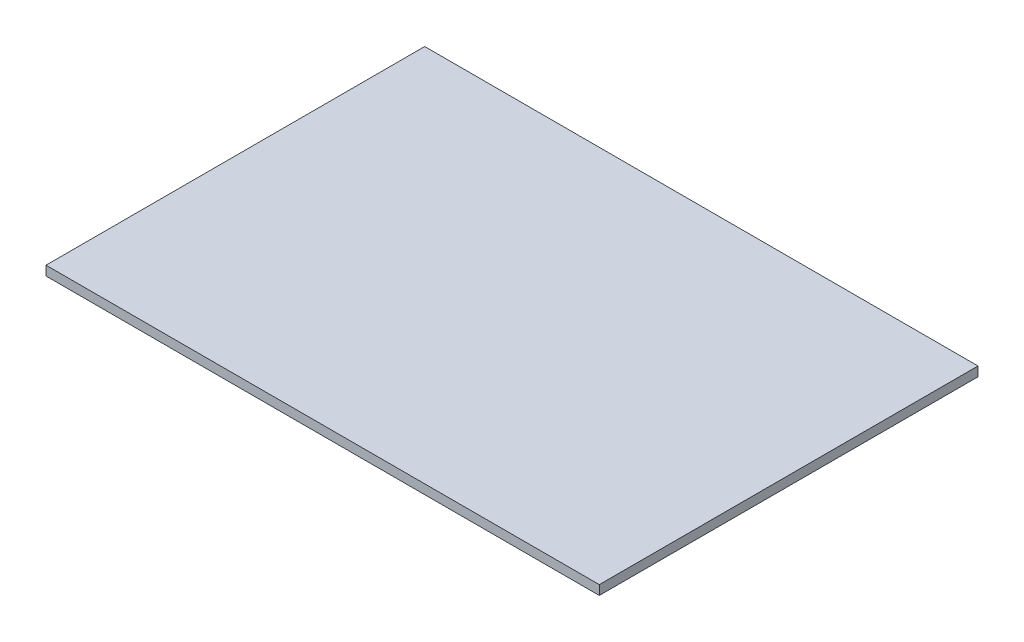
ISO-10303-21;
HEADER;
FILE_DESCRIPTION(('STEP AP214'),'2;1');
FILE_NAME('part.step','',(''),(''),'','','');
FILE_SCHEMA(('AUTOMOTIVE_DESIGN { 1 0 10303 214 1 1 1 1 }'));
ENDSEC;
DATA;
#1=APPLICATION_CONTEXT('core data for automotive mechanical design processes');
#2=APPLICATION_PROTOCOL_DEFINITION('international standard','automotive_design',2000,#1);
#3=PRODUCT_CONTEXT('',#1,'mechanical');
#4=PRODUCT('Part','Part','',(#3));
#5=PRODUCT_RELATED_PRODUCT_CATEGORY('part','',(#4));
#6=PRODUCT_DEFINITION_FORMATION('','',#4);
#7=PRODUCT_DEFINITION_CONTEXT('part definition',#1,'design');
#8=PRODUCT_DEFINITION('design','',#6,#7);
#9=PRODUCT_DEFINITION_SHAPE('','',#8);
#10=(LENGTH_UNIT() NAMED_UNIT(*) SI_UNIT(.MILLI.,.METRE.));
#11=(NAMED_UNIT(*) PLANE_ANGLE_UNIT() SI_UNIT($,.RADIAN.));
#12=(NAMED_UNIT(*) SI_UNIT($,.STERADIAN.) SOLID_ANGLE_UNIT());
#13=UNCERTAINTY_MEASURE_WITH_UNIT(LENGTH_MEASURE(1.E-05),#10,'distance_accuracy_value','');
#14=(GEOMETRIC_REPRESENTATION_CONTEXT(3) GLOBAL_UNCERTAINTY_ASSIGNED_CONTEXT((#13)) GLOBAL_UNIT_ASSIGNED_CONTEXT((#10,
#11,#12)) REPRESENTATION_CONTEXT('',''));
#15=CARTESIAN_POINT('',(0.,0.,0.));
#16=DIRECTION('',(0.,0.,1.));
#17=DIRECTION('',(1.,0.,0.));
#18=AXIS2_PLACEMENT_3D('',#15,#16,#17);
#19=CARTESIAN_POINT('',(0.,3.5,0.));
#20=DIRECTION('',(0.,0.,-1.));
#21=DIRECTION('',(-1.,0.,0.));
#22=AXIS2_PLACEMENT_3D('',#19,#20,#21);
#23=PLANE('',#22);
#24=DIRECTION('',(1.,0.,0.));
#25=VECTOR('',#24,1.);
#26=CARTESIAN_POINT('',(0.,0.,0.));
#27=LINE('',#26,#25);
#28=CARTESIAN_POINT('',(0.,0.,0.));
#29=VERTEX_POINT('',#28);
#30=CARTESIAN_POINT('',(206.,0.,0.));
#31=VERTEX_POINT('',#30);
#32=EDGE_CURVE('E98',#29,#31,#27,.T.);
#33=ORIENTED_EDGE('',*,*,#32,.T.);
#34=DIRECTION('',(0.,-1.,0.));
#35=VECTOR('',#34,1.);
#36=CARTESIAN_POINT('',(206.,3.5,0.));
#37=LINE('',#36,#35);
#38=CARTESIAN_POINT('',(206.,3.5,0.));
#39=VERTEX_POINT('',#38);
#40=EDGE_CURVE('E11',#39,#31,#37,.T.);
#41=ORIENTED_EDGE('',*,*,#40,.F.);
#42=DIRECTION('',(1.,0.,0.));
#43=VECTOR('',#42,1.);
#44=CARTESIAN_POINT('',(0.,3.5,0.));
#45=LINE('',#44,#43);
#46=CARTESIAN_POINT('',(0.,3.5,0.));
#47=VERTEX_POINT('',#46);
#48=EDGE_CURVE('E84',#47,#39,#45,.T.);
#49=ORIENTED_EDGE('',*,*,#48,.F.);
#50=DIRECTION('',(0.,-1.,0.));
#51=VECTOR('',#50,1.);
#52=CARTESIAN_POINT('',(0.,3.5,0.));
#53=LINE('',#52,#51);
#54=EDGE_CURVE('E51',#47,#29,#53,.T.);
#55=ORIENTED_EDGE('',*,*,#54,.T.);
#56=EDGE_LOOP('',(#33,#41,#49,#55));
#57=FACE_BOUND('',#56,.T.);
#58=ADVANCED_FACE('F35',(#57),#23,.F.);
#59=CARTESIAN_POINT('',(206.,3.5,0.));
#60=DIRECTION('',(-1.,0.,0.));
#61=DIRECTION('',(0.,0.,1.));
#62=AXIS2_PLACEMENT_3D('',#59,#60,#61);
#63=PLANE('',#62);
#64=DIRECTION('',(0.,0.,-1.));
#65=VECTOR('',#64,1.);
#66=CARTESIAN_POINT('',(206.,0.,0.));
#67=LINE('',#66,#65);
#68=CARTESIAN_POINT('',(206.,0.,-141.));
#69=VERTEX_POINT('',#68);
#70=EDGE_CURVE('E89',#31,#69,#67,.T.);
#71=ORIENTED_EDGE('',*,*,#70,.T.);
#72=DIRECTION('',(0.,-1.,0.));
#73=VECTOR('',#72,1.);
#74=CARTESIAN_POINT('',(206.,3.5,-141.));
#75=LINE('',#74,#73);
#76=CARTESIAN_POINT('',(206.,3.5,-141.));
#77=VERTEX_POINT('',#76);
#78=EDGE_CURVE('E43',#77,#69,#75,.T.);
#79=ORIENTED_EDGE('',*,*,#78,.F.);
#80=DIRECTION('',(0.,0.,-1.));
#81=VECTOR('',#80,1.);
#82=CARTESIAN_POINT('',(206.,3.5,0.));
#83=LINE('',#82,#81);
#84=EDGE_CURVE('E76',#39,#77,#83,.T.);
#85=ORIENTED_EDGE('',*,*,#84,.F.);
#86=ORIENTED_EDGE('',*,*,#40,.T.);
#87=EDGE_LOOP('',(#71,#79,#85,#86));
#88=FACE_BOUND('',#87,.T.);
#89=ADVANCED_FACE('F88',(#88),#63,.F.);
#90=CARTESIAN_POINT('',(0.,3.5,-141.));
#91=DIRECTION('',(0.,0.,-1.));
#92=DIRECTION('',(-1.,0.,0.));
#93=AXIS2_PLACEMENT_3D('',#90,#91,#92);
#94=PLANE('',#93);
#95=DIRECTION('',(1.,0.,0.));
#96=VECTOR('',#95,1.);
#97=CARTESIAN_POINT('',(0.,0.,-141.));
#98=LINE('',#97,#96);
#99=CARTESIAN_POINT('',(0.,0.,-141.));
#100=VERTEX_POINT('',#99);
#101=EDGE_CURVE('E102',#100,#69,#98,.T.);
#102=ORIENTED_EDGE('',*,*,#101,.F.);
#103=DIRECTION('',(0.,-1.,0.));
#104=VECTOR('',#103,1.);
#105=CARTESIAN_POINT('',(0.,3.5,-141.));
#106=LINE('',#105,#104);
#107=CARTESIAN_POINT('',(0.,3.5,-141.));
#108=VERTEX_POINT('',#107);
#109=EDGE_CURVE('E65',#108,#100,#106,.T.);
#110=ORIENTED_EDGE('',*,*,#109,.F.);
#111=DIRECTION('',(1.,0.,0.));
#112=VECTOR('',#111,1.);
#113=CARTESIAN_POINT('',(0.,3.5,-141.));
#114=LINE('',#113,#112);
#115=EDGE_CURVE('E83',#108,#77,#114,.T.);
#116=ORIENTED_EDGE('',*,*,#115,.T.);
#117=ORIENTED_EDGE('',*,*,#78,.T.);
#118=EDGE_LOOP('',(#102,#110,#116,#117));
#119=FACE_BOUND('',#118,.T.);
#120=ADVANCED_FACE('F92',(#119),#94,.T.);
#121=CARTESIAN_POINT('',(0.,3.5,0.));
#122=DIRECTION('',(-1.,0.,0.));
#123=DIRECTION('',(0.,0.,1.));
#124=AXIS2_PLACEMENT_3D('',#121,#122,#123);
#125=PLANE('',#124);
#126=DIRECTION('',(0.,0.,-1.));
#127=VECTOR('',#126,1.);
#128=CARTESIAN_POINT('',(0.,0.,0.));
#129=LINE('',#128,#127);
#130=EDGE_CURVE('E104',#29,#100,#129,.T.);
#131=ORIENTED_EDGE('',*,*,#130,.F.);
#132=ORIENTED_EDGE('',*,*,#54,.F.);
#133=DIRECTION('',(0.,0.,-1.));
#134=VECTOR('',#133,1.);
#135=CARTESIAN_POINT('',(0.,3.5,0.));
#136=LINE('',#135,#134);
#137=EDGE_CURVE('E93',#47,#108,#136,.T.);
#138=ORIENTED_EDGE('',*,*,#137,.T.);
#139=ORIENTED_EDGE('',*,*,#109,.T.);
#140=EDGE_LOOP('',(#131,#132,#138,#139));
#141=FACE_BOUND('',#140,.T.);
#142=ADVANCED_FACE('F150',(#141),#125,.T.);
#143=CARTESIAN_POINT('',(0.,3.5,0.));
#144=DIRECTION('',(0.,1.,0.));
#145=DIRECTION('',(0.,0.,1.));
#146=AXIS2_PLACEMENT_3D('',#143,#144,#145);
#147=PLANE('',#146);
#148=ORIENTED_EDGE('',*,*,#48,.T.);
#149=ORIENTED_EDGE('',*,*,#84,.T.);
#150=ORIENTED_EDGE('',*,*,#115,.F.);
#151=ORIENTED_EDGE('',*,*,#137,.F.);
#152=EDGE_LOOP('',(#148,#149,#150,#151));
#153=FACE_BOUND('',#152,.T.);
#154=ADVANCED_FACE('F80',(#153),#147,.T.);
#155=CARTESIAN_POINT('',(0.,0.,0.));
#156=DIRECTION('',(0.,1.,0.));
#157=DIRECTION('',(0.,0.,1.));
#158=AXIS2_PLACEMENT_3D('',#155,#156,#157);
#159=PLANE('',#158);
#160=CARTESIAN_POINT('',(4.49999999999998,0.,-136.5));
#161=DIRECTION('',(0.,1.,0.));
#162=DIRECTION('',(0.,0.,1.));
#163=AXIS2_PLACEMENT_3D('',#160,#161,#162);
#164=CIRCLE('',#163,1.972314148255);
#165=CARTESIAN_POINT('',(4.49999999999998,0.,-134.527685851745));
#166=VERTEX_POINT('',#165);
#167=EDGE_CURVE('E128',#166,#166,#164,.T.);
#168=ORIENTED_EDGE('',*,*,#167,.T.);
#169=EDGE_LOOP('',(#168));
#170=FACE_BOUND('',#169,.T.);
#171=CARTESIAN_POINT('',(4.5,0.,-4.5));
#172=DIRECTION('',(0.,1.,0.));
#173=DIRECTION('',(0.,0.,1.));
#174=AXIS2_PLACEMENT_3D('',#171,#172,#173);
#175=CIRCLE('',#174,1.972314148255);
#176=CARTESIAN_POINT('',(4.5,0.,-2.527685851745));
#177=VERTEX_POINT('',#176);
#178=EDGE_CURVE('E122',#177,#177,#175,.T.);
#179=ORIENTED_EDGE('',*,*,#178,.T.);
#180=EDGE_LOOP('',(#179));
#181=FACE_BOUND('',#180,.T.);
#182=CARTESIAN_POINT('',(201.5,0.,-4.5));
#183=DIRECTION('',(0.,1.,0.));
#184=DIRECTION('',(0.,0.,1.));
#185=AXIS2_PLACEMENT_3D('',#182,#183,#184);
#186=CIRCLE('',#185,1.972314148255);
#187=CARTESIAN_POINT('',(201.5,0.,-2.527685851745));
#188=VERTEX_POINT('',#187);
#189=EDGE_CURVE('E116',#188,#188,#186,.T.);
#190=ORIENTED_EDGE('',*,*,#189,.T.);
#191=EDGE_LOOP('',(#190));
#192=FACE_BOUND('',#191,.T.);
#193=CARTESIAN_POINT('',(201.5,0.,-104.5));
#194=DIRECTION('',(0.,1.,0.));
#195=DIRECTION('',(0.,0.,1.));
#196=AXIS2_PLACEMENT_3D('',#193,#194,#195);
#197=CIRCLE('',#196,1.972314148255);
#198=CARTESIAN_POINT('',(201.5,0.,-102.527685851745));
#199=VERTEX_POINT('',#198);
#200=EDGE_CURVE('E110',#199,#199,#197,.T.);
#201=ORIENTED_EDGE('',*,*,#200,.T.);
#202=EDGE_LOOP('',(#201));
#203=FACE_BOUND('',#202,.T.);
#204=ORIENTED_EDGE('',*,*,#32,.F.);
#205=ORIENTED_EDGE('',*,*,#130,.T.);
#206=ORIENTED_EDGE('',*,*,#101,.T.);
#207=ORIENTED_EDGE('',*,*,#70,.F.);
#208=EDGE_LOOP('',(#204,#205,#206,#207));
#209=FACE_BOUND('',#208,.T.);
#210=ADVANCED_FACE('F149',(#170,#181,#192,#203,#209),#159,.F.);
#211=CARTESIAN_POINT('',(201.5,1.85,-104.5));
#212=DIRECTION('',(0.,-1.,0.));
#213=DIRECTION('',(0.,0.,-1.));
#214=AXIS2_PLACEMENT_3D('',#211,#212,#213);
#215=CYLINDRICAL_SURFACE('',#214,1.972314148255);
#216=CARTESIAN_POINT('',(201.5,1.85,-104.5));
#217=DIRECTION('',(0.,1.,0.));
#218=DIRECTION('',(0.,0.,1.));
#219=AXIS2_PLACEMENT_3D('',#216,#217,#218);
#220=CIRCLE('',#219,1.972314148255);
#221=CARTESIAN_POINT('',(201.5,1.85,-102.527685851745));
#222=VERTEX_POINT('',#221);
#223=EDGE_CURVE('E113',#222,#222,#220,.T.);
#224=ORIENTED_EDGE('',*,*,#223,.T.);
#225=EDGE_LOOP('',(#224));
#226=FACE_BOUND('',#225,.T.);
#227=ORIENTED_EDGE('',*,*,#200,.F.);
#228=EDGE_LOOP('',(#227));
#229=FACE_BOUND('',#228,.T.);
#230=ADVANCED_FACE('F161',(#226,#229),#215,.F.);
#231=CARTESIAN_POINT('',(0.,1.85,0.));
#232=DIRECTION('',(0.,1.,0.));
#233=DIRECTION('',(0.,0.,1.));
#234=AXIS2_PLACEMENT_3D('',#231,#232,#233);
#235=PLANE('',#234);
#236=ORIENTED_EDGE('',*,*,#223,.F.);
#237=EDGE_LOOP('',(#236));
#238=FACE_BOUND('',#237,.T.);
#239=ADVANCED_FACE('F166',(#238),#235,.F.);
#240=CARTESIAN_POINT('',(201.5,1.85,-4.5));
#241=DIRECTION('',(0.,-1.,0.));
#242=DIRECTION('',(0.,0.,-1.));
#243=AXIS2_PLACEMENT_3D('',#240,#241,#242);
#244=CYLINDRICAL_SURFACE('',#243,1.972314148255);
#245=CARTESIAN_POINT('',(201.5,1.85,-4.5));
#246=DIRECTION('',(0.,1.,0.));
#247=DIRECTION('',(0.,0.,1.));
#248=AXIS2_PLACEMENT_3D('',#245,#246,#247);
#249=CIRCLE('',#248,1.972314148255);
#250=CARTESIAN_POINT('',(201.5,1.85,-2.527685851745));
#251=VERTEX_POINT('',#250);
#252=EDGE_CURVE('E119',#251,#251,#249,.T.);
#253=ORIENTED_EDGE('',*,*,#252,.T.);
#254=EDGE_LOOP('',(#253));
#255=FACE_BOUND('',#254,.T.);
#256=ORIENTED_EDGE('',*,*,#189,.F.);
#257=EDGE_LOOP('',(#256));
#258=FACE_BOUND('',#257,.T.);
#259=ADVANCED_FACE('F170',(#255,#258),#244,.F.);
#260=CARTESIAN_POINT('',(0.,1.85,0.));
#261=DIRECTION('',(0.,1.,0.));
#262=DIRECTION('',(0.,0.,1.));
#263=AXIS2_PLACEMENT_3D('',#260,#261,#262);
#264=PLANE('',#263);
#265=ORIENTED_EDGE('',*,*,#252,.F.);
#266=EDGE_LOOP('',(#265));
#267=FACE_BOUND('',#266,.T.);
#268=ADVANCED_FACE('F174',(#267),#264,.F.);
#269=CARTESIAN_POINT('',(4.5,1.85,-4.5));
#270=DIRECTION('',(0.,-1.,0.));
#271=DIRECTION('',(0.,0.,-1.));
#272=AXIS2_PLACEMENT_3D('',#269,#270,#271);
#273=CYLINDRICAL_SURFACE('',#272,1.972314148255);
#274=CARTESIAN_POINT('',(4.5,1.85,-4.5));
#275=DIRECTION('',(0.,1.,0.));
#276=DIRECTION('',(0.,0.,1.));
#277=AXIS2_PLACEMENT_3D('',#274,#275,#276);
#278=CIRCLE('',#277,1.972314148255);
#279=CARTESIAN_POINT('',(4.5,1.85,-2.527685851745));
#280=VERTEX_POINT('',#279);
#281=EDGE_CURVE('E125',#280,#280,#278,.T.);
#282=ORIENTED_EDGE('',*,*,#281,.T.);
#283=EDGE_LOOP('',(#282));
#284=FACE_BOUND('',#283,.T.);
#285=ORIENTED_EDGE('',*,*,#178,.F.);
#286=EDGE_LOOP('',(#285));
#287=FACE_BOUND('',#286,.T.);
#288=ADVANCED_FACE('F178',(#284,#287),#273,.F.);
#289=CARTESIAN_POINT('',(0.,1.85,0.));
#290=DIRECTION('',(0.,1.,0.));
#291=DIRECTION('',(0.,0.,1.));
#292=AXIS2_PLACEMENT_3D('',#289,#290,#291);
#293=PLANE('',#292);
#294=ORIENTED_EDGE('',*,*,#281,.F.);
#295=EDGE_LOOP('',(#294));
#296=FACE_BOUND('',#295,.T.);
#297=ADVANCED_FACE('F143',(#296),#293,.F.);
#298=CARTESIAN_POINT('',(4.49999999999998,1.85,-136.5));
#299=DIRECTION('',(0.,-1.,0.));
#300=DIRECTION('',(0.,0.,-1.));
#301=AXIS2_PLACEMENT_3D('',#298,#299,#300);
#302=CYLINDRICAL_SURFACE('',#301,1.972314148255);
#303=CARTESIAN_POINT('',(4.49999999999998,1.85,-136.5));
#304=DIRECTION('',(0.,1.,0.));
#305=DIRECTION('',(0.,0.,1.));
#306=AXIS2_PLACEMENT_3D('',#303,#304,#305);
#307=CIRCLE('',#306,1.972314148255);
#308=CARTESIAN_POINT('',(4.49999999999998,1.85,-134.527685851745));
#309=VERTEX_POINT('',#308);
#310=EDGE_CURVE('E100',#309,#309,#307,.T.);
#311=ORIENTED_EDGE('',*,*,#310,.T.);
#312=EDGE_LOOP('',(#311));
#313=FACE_BOUND('',#312,.T.);
#314=ORIENTED_EDGE('',*,*,#167,.F.);
#315=EDGE_LOOP('',(#314));
#316=FACE_BOUND('',#315,.T.);
#317=ADVANCED_FACE('F134',(#313,#316),#302,.F.);
#318=CARTESIAN_POINT('',(0.,1.85,0.));
#319=DIRECTION('',(0.,1.,0.));
#320=DIRECTION('',(0.,0.,1.));
#321=AXIS2_PLACEMENT_3D('',#318,#319,#320);
#322=PLANE('',#321);
#323=ORIENTED_EDGE('',*,*,#310,.F.);
#324=EDGE_LOOP('',(#323));
#325=FACE_BOUND('',#324,.T.);
#326=ADVANCED_FACE('F137',(#325),#322,.F.);
#327=CLOSED_SHELL('',(#58,#89,#120,#142,#154,#210,#230,#239,#259,#268,#288,#297,#317,#326));
#328=MANIFOLD_SOLID_BREP('B2',#327);
#329=ADVANCED_BREP_SHAPE_REPRESENTATION('',(#18,#328),#14);
#330=SHAPE_DEFINITION_REPRESENTATION(#9,#329);
ENDSEC;
END-ISO-10303-21;
